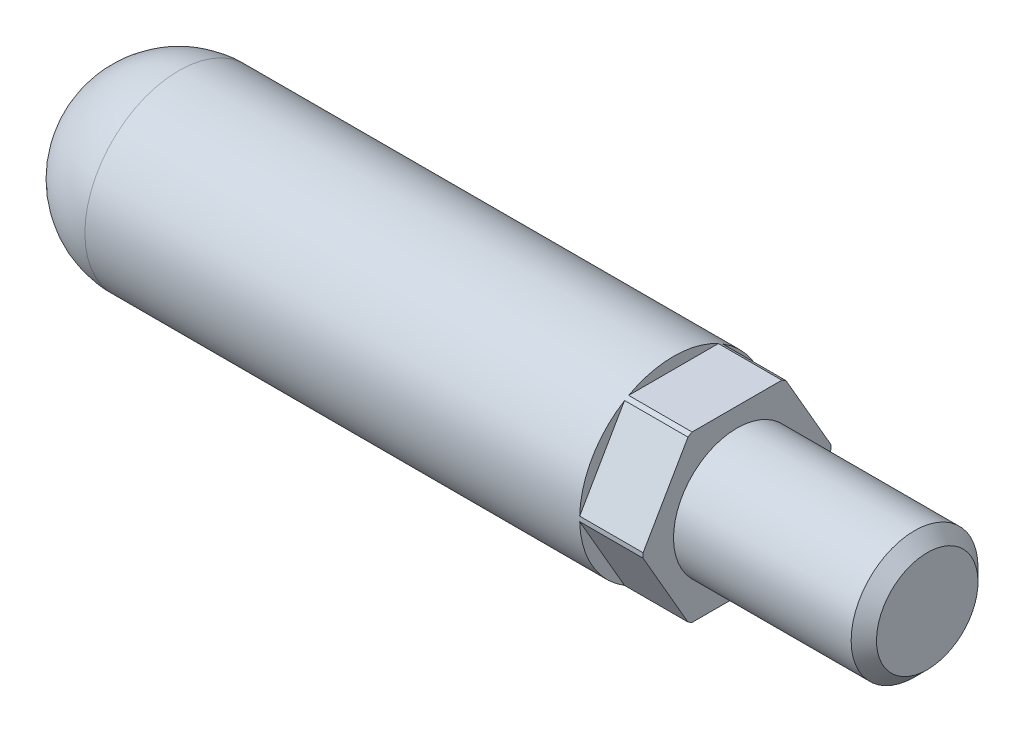
ISO-10303-21;
HEADER;
FILE_DESCRIPTION(('STEP AP214'),'2;1');
FILE_NAME('part.step','',(''),(''),'','','');
FILE_SCHEMA(('AUTOMOTIVE_DESIGN { 1 0 10303 214 1 1 1 1 }'));
ENDSEC;
DATA;
#1=APPLICATION_CONTEXT('core data for automotive mechanical design processes');
#2=APPLICATION_PROTOCOL_DEFINITION('international standard','automotive_design',2000,#1);
#3=PRODUCT_CONTEXT('',#1,'mechanical');
#4=PRODUCT('Part','Part','',(#3));
#5=PRODUCT_RELATED_PRODUCT_CATEGORY('part','',(#4));
#6=PRODUCT_DEFINITION_FORMATION('','',#4);
#7=PRODUCT_DEFINITION_CONTEXT('part definition',#1,'design');
#8=PRODUCT_DEFINITION('design','',#6,#7);
#9=PRODUCT_DEFINITION_SHAPE('','',#8);
#10=(LENGTH_UNIT() NAMED_UNIT(*) SI_UNIT(.MILLI.,.METRE.));
#11=(NAMED_UNIT(*) PLANE_ANGLE_UNIT() SI_UNIT($,.RADIAN.));
#12=(NAMED_UNIT(*) SI_UNIT($,.STERADIAN.) SOLID_ANGLE_UNIT());
#13=UNCERTAINTY_MEASURE_WITH_UNIT(LENGTH_MEASURE(1.E-05),#10,'distance_accuracy_value','');
#14=(GEOMETRIC_REPRESENTATION_CONTEXT(3) GLOBAL_UNCERTAINTY_ASSIGNED_CONTEXT((#13)) GLOBAL_UNIT_ASSIGNED_CONTEXT((#10,
#11,#12)) REPRESENTATION_CONTEXT('',''));
#15=CARTESIAN_POINT('',(0.,0.,0.));
#16=DIRECTION('',(0.,0.,1.));
#17=DIRECTION('',(1.,0.,0.));
#18=AXIS2_PLACEMENT_3D('',#15,#16,#17);
#19=CARTESIAN_POINT('',(0.,2.5,0.));
#20=DIRECTION('',(1.,0.,0.));
#21=DIRECTION('',(0.,0.,-1.));
#22=AXIS2_PLACEMENT_3D('',#19,#20,#21);
#23=PLANE('',#22);
#24=CARTESIAN_POINT('',(5.11590119225969E-10,0.,0.));
#25=DIRECTION('',(-1.,0.,0.));
#26=DIRECTION('',(0.,-1.,0.));
#27=AXIS2_PLACEMENT_3D('',#24,#25,#26);
#28=CIRCLE('',#27,4.00000000047385);
#29=CARTESIAN_POINT('',(5.11590639643012E-10,-4.00000000047385,0.));
#30=VERTEX_POINT('',#29);
#31=EDGE_CURVE('E20',#30,#30,#28,.T.);
#32=ORIENTED_EDGE('',*,*,#31,.F.);
#33=EDGE_LOOP('',(#32));
#34=FACE_BOUND('',#33,.T.);
#35=ADVANCED_FACE('F17',(#34),#23,.T.);
#36=CARTESIAN_POINT('',(-1.0000000004311,0.,0.));
#37=DIRECTION('',(-1.,0.,0.));
#38=DIRECTION('',(0.,-1.,0.));
#39=AXIS2_PLACEMENT_3D('',#36,#37,#38);
#40=CONICAL_SURFACE('',#39,4.99999999959755,0.785398162487953);
#41=ORIENTED_EDGE('',*,*,#31,.T.);
#42=EDGE_LOOP('',(#41));
#43=FACE_BOUND('',#42,.T.);
#44=CARTESIAN_POINT('',(-1.,0.,0.));
#45=DIRECTION('',(1.,0.,0.));
#46=DIRECTION('',(0.,1.,0.));
#47=AXIS2_PLACEMENT_3D('',#44,#45,#46);
#48=CIRCLE('',#47,5.);
#49=CARTESIAN_POINT('',(-1.,5.,0.));
#50=VERTEX_POINT('',#49);
#51=EDGE_CURVE('E200',#50,#50,#48,.F.);
#52=ORIENTED_EDGE('',*,*,#51,.F.);
#53=EDGE_LOOP('',(#52));
#54=FACE_BOUND('',#53,.T.);
#55=ADVANCED_FACE('F215',(#43,#54),#40,.T.);
#56=CARTESIAN_POINT('',(-7.5,0.,0.));
#57=DIRECTION('',(1.,0.,0.));
#58=DIRECTION('',(0.,1.,0.));
#59=AXIS2_PLACEMENT_3D('',#56,#57,#58);
#60=CYLINDRICAL_SURFACE('',#59,5.);
#61=ORIENTED_EDGE('',*,*,#51,.T.);
#62=EDGE_LOOP('',(#61));
#63=FACE_BOUND('',#62,.T.);
#64=CARTESIAN_POINT('',(-15.,0.,0.));
#65=DIRECTION('',(1.,0.,0.));
#66=DIRECTION('',(0.,1.,0.));
#67=AXIS2_PLACEMENT_3D('',#64,#65,#66);
#68=CIRCLE('',#67,5.);
#69=CARTESIAN_POINT('',(-15.,5.,0.));
#70=VERTEX_POINT('',#69);
#71=EDGE_CURVE('E197',#70,#70,#68,.F.);
#72=ORIENTED_EDGE('',*,*,#71,.F.);
#73=EDGE_LOOP('',(#72));
#74=FACE_BOUND('',#73,.T.);
#75=ADVANCED_FACE('F212',(#63,#74),#60,.T.);
#76=CARTESIAN_POINT('',(-15.,6.2,0.));
#77=DIRECTION('',(1.,0.,0.));
#78=DIRECTION('',(0.,0.,-1.));
#79=AXIS2_PLACEMENT_3D('',#76,#77,#78);
#80=PLANE('',#79);
#81=ORIENTED_EDGE('',*,*,#71,.T.);
#82=EDGE_LOOP('',(#81));
#83=FACE_BOUND('',#82,.T.);
#84=DIRECTION('',(0.,-0.866025403784439,0.5));
#85=VECTOR('',#84,1.);
#86=CARTESIAN_POINT('',(-15.,-0.18691332150068,-7.39763904298159));
#87=LINE('',#86,#85);
#88=CARTESIAN_POINT('',(-15.,-6.31308667849932,-3.86069120621611));
#89=VERTEX_POINT('',#88);
#90=CARTESIAN_POINT('',(-15.,-0.186913321500685,-7.39763904298159));
#91=VERTEX_POINT('',#90);
#92=EDGE_CURVE('E186',#89,#91,#87,.F.);
#93=ORIENTED_EDGE('',*,*,#92,.T.);
#94=CARTESIAN_POINT('',(-15.,0.,0.));
#95=DIRECTION('',(1.,0.,0.));
#96=DIRECTION('',(0.,1.,0.));
#97=AXIS2_PLACEMENT_3D('',#94,#95,#96);
#98=CIRCLE('',#97,7.4);
#99=CARTESIAN_POINT('',(-15.,0.186913321500679,-7.39763904298159));
#100=VERTEX_POINT('',#99);
#101=EDGE_CURVE('E282',#91,#100,#98,.T.);
#102=ORIENTED_EDGE('',*,*,#101,.T.);
#103=DIRECTION('',(0.,-0.866025403784439,-0.5));
#104=VECTOR('',#103,1.);
#105=CARTESIAN_POINT('',(-15.,6.31308667849932,-3.86069120621611));
#106=LINE('',#105,#104);
#107=CARTESIAN_POINT('',(-15.,6.31308667849932,-3.86069120621611));
#108=VERTEX_POINT('',#107);
#109=EDGE_CURVE('E195',#100,#108,#106,.F.);
#110=ORIENTED_EDGE('',*,*,#109,.T.);
#111=CARTESIAN_POINT('',(-15.,0.,0.));
#112=DIRECTION('',(1.,0.,0.));
#113=DIRECTION('',(0.,1.,0.));
#114=AXIS2_PLACEMENT_3D('',#111,#112,#113);
#115=CIRCLE('',#114,7.4);
#116=CARTESIAN_POINT('',(-15.,6.5,-3.53694783676547));
#117=VERTEX_POINT('',#116);
#118=EDGE_CURVE('E85',#108,#117,#115,.T.);
#119=ORIENTED_EDGE('',*,*,#118,.T.);
#120=DIRECTION('',(0.,0.,-1.));
#121=VECTOR('',#120,1.);
#122=CARTESIAN_POINT('',(-15.,6.5,3.53694783676548));
#123=LINE('',#122,#121);
#124=CARTESIAN_POINT('',(-15.,6.5,3.53694783676547));
#125=VERTEX_POINT('',#124);
#126=EDGE_CURVE('E127',#117,#125,#123,.F.);
#127=ORIENTED_EDGE('',*,*,#126,.T.);
#128=CARTESIAN_POINT('',(-15.,0.,0.));
#129=DIRECTION('',(1.,0.,0.));
#130=DIRECTION('',(0.,1.,0.));
#131=AXIS2_PLACEMENT_3D('',#128,#129,#130);
#132=CIRCLE('',#131,7.4);
#133=CARTESIAN_POINT('',(-15.,6.31308667849931,3.86069120621611));
#134=VERTEX_POINT('',#133);
#135=EDGE_CURVE('E134',#125,#134,#132,.T.);
#136=ORIENTED_EDGE('',*,*,#135,.T.);
#137=DIRECTION('',(0.,0.866025403784439,-0.5));
#138=VECTOR('',#137,1.);
#139=CARTESIAN_POINT('',(-15.,0.186913321500675,7.39763904298159));
#140=LINE('',#139,#138);
#141=CARTESIAN_POINT('',(-15.,0.186913321500679,7.39763904298159));
#142=VERTEX_POINT('',#141);
#143=EDGE_CURVE('E149',#134,#142,#140,.F.);
#144=ORIENTED_EDGE('',*,*,#143,.T.);
#145=CARTESIAN_POINT('',(-15.,0.,0.));
#146=DIRECTION('',(1.,0.,0.));
#147=DIRECTION('',(0.,1.,0.));
#148=AXIS2_PLACEMENT_3D('',#145,#146,#147);
#149=CIRCLE('',#148,7.4);
#150=CARTESIAN_POINT('',(-15.,-0.186913321500684,7.39763904298159));
#151=VERTEX_POINT('',#150);
#152=EDGE_CURVE('E288',#142,#151,#149,.T.);
#153=ORIENTED_EDGE('',*,*,#152,.T.);
#154=DIRECTION('',(0.,0.866025403784439,0.5));
#155=VECTOR('',#154,1.);
#156=CARTESIAN_POINT('',(-15.,-6.31308667849932,3.86069120621611));
#157=LINE('',#156,#155);
#158=CARTESIAN_POINT('',(-15.,-6.31308667849932,3.86069120621612));
#159=VERTEX_POINT('',#158);
#160=EDGE_CURVE('E161',#151,#159,#157,.F.);
#161=ORIENTED_EDGE('',*,*,#160,.T.);
#162=CARTESIAN_POINT('',(-15.,0.,0.));
#163=DIRECTION('',(1.,0.,0.));
#164=DIRECTION('',(0.,1.,0.));
#165=AXIS2_PLACEMENT_3D('',#162,#163,#164);
#166=CIRCLE('',#165,7.4);
#167=CARTESIAN_POINT('',(-15.,-6.5,3.53694783676548));
#168=VERTEX_POINT('',#167);
#169=EDGE_CURVE('E286',#159,#168,#166,.T.);
#170=ORIENTED_EDGE('',*,*,#169,.T.);
#171=DIRECTION('',(0.,0.,1.));
#172=VECTOR('',#171,1.);
#173=CARTESIAN_POINT('',(-15.,-6.5,-3.53694783676548));
#174=LINE('',#173,#172);
#175=CARTESIAN_POINT('',(-15.,-6.5,-3.53694783676547));
#176=VERTEX_POINT('',#175);
#177=EDGE_CURVE('E174',#168,#176,#174,.F.);
#178=ORIENTED_EDGE('',*,*,#177,.T.);
#179=CARTESIAN_POINT('',(-15.,0.,0.));
#180=DIRECTION('',(1.,0.,0.));
#181=DIRECTION('',(0.,1.,0.));
#182=AXIS2_PLACEMENT_3D('',#179,#180,#181);
#183=CIRCLE('',#182,7.4);
#184=EDGE_CURVE('E284',#176,#89,#183,.T.);
#185=ORIENTED_EDGE('',*,*,#184,.T.);
#186=EDGE_LOOP('',(#93,#102,#110,#119,#127,#136,#144,#153,#161,#170,#178,#185));
#187=FACE_BOUND('',#186,.T.);
#188=ADVANCED_FACE('F208',(#83,#187),#80,.T.);
#189=CARTESIAN_POINT('',(-59.,0.,0.));
#190=DIRECTION('',(0.,-1.,0.));
#191=DIRECTION('',(0.,0.,-1.));
#192=AXIS2_PLACEMENT_3D('',#189,#190,#191);
#193=SPHERICAL_SURFACE('',#192,7.4);
#194=CARTESIAN_POINT('',(-59.,0.,0.));
#195=DIRECTION('',(1.,0.,0.));
#196=DIRECTION('',(0.,1.,0.));
#197=AXIS2_PLACEMENT_3D('',#194,#195,#196);
#198=CIRCLE('',#197,7.4);
#199=CARTESIAN_POINT('',(-59.,-7.4,0.));
#200=VERTEX_POINT('',#199);
#201=CARTESIAN_POINT('',(-59.,7.39999999999999,0.));
#202=VERTEX_POINT('',#201);
#203=EDGE_CURVE('E34',#200,#202,#198,.T.);
#204=ORIENTED_EDGE('',*,*,#203,.F.);
#205=CARTESIAN_POINT('',(-59.,0.,0.));
#206=DIRECTION('',(1.,0.,0.));
#207=DIRECTION('',(0.,1.,0.));
#208=AXIS2_PLACEMENT_3D('',#205,#206,#207);
#209=CIRCLE('',#208,7.4);
#210=EDGE_CURVE('E126',#202,#200,#209,.T.);
#211=ORIENTED_EDGE('',*,*,#210,.F.);
#212=EDGE_LOOP('',(#204,#211));
#213=FACE_BOUND('',#212,.T.);
#214=ADVANCED_FACE('F203',(#213),#193,.T.);
#215=CARTESIAN_POINT('',(-20.,3.3872642821033,-5.86691383526623));
#216=DIRECTION('',(1.,0.,0.));
#217=DIRECTION('',(0.,0.,-1.));
#218=AXIS2_PLACEMENT_3D('',#215,#216,#217);
#219=PLANE('',#218);
#220=DIRECTION('',(0.,-0.866025403784439,-0.5));
#221=VECTOR('',#220,1.);
#222=CARTESIAN_POINT('',(-20.,6.31308667849932,-3.86069120621611));
#223=LINE('',#222,#221);
#224=CARTESIAN_POINT('',(-20.,6.31308667849932,-3.86069120621611));
#225=VERTEX_POINT('',#224);
#226=CARTESIAN_POINT('',(-20.,0.186913321500679,-7.39763904298159));
#227=VERTEX_POINT('',#226);
#228=EDGE_CURVE('E92',#225,#227,#223,.T.);
#229=ORIENTED_EDGE('',*,*,#228,.T.);
#230=CARTESIAN_POINT('',(-20.,0.,0.));
#231=DIRECTION('',(1.,0.,0.));
#232=DIRECTION('',(0.,1.,0.));
#233=AXIS2_PLACEMENT_3D('',#230,#231,#232);
#234=CIRCLE('',#233,7.4);
#235=EDGE_CURVE('E191',#225,#227,#234,.F.);
#236=ORIENTED_EDGE('',*,*,#235,.F.);
#237=EDGE_LOOP('',(#229,#236));
#238=FACE_BOUND('',#237,.T.);
#239=ADVANCED_FACE('F207',(#238),#219,.T.);
#240=CARTESIAN_POINT('',(-15.,6.31308667849932,-3.86069120621611));
#241=DIRECTION('',(0.,-0.5,0.866025403784439));
#242=DIRECTION('',(0.,-0.866025403784439,-0.5));
#243=AXIS2_PLACEMENT_3D('',#240,#241,#242);
#244=PLANE('',#243);
#245=DIRECTION('',(1.,0.,0.));
#246=VECTOR('',#245,1.);
#247=CARTESIAN_POINT('',(-37.,6.31308667849931,-3.86069120621611));
#248=LINE('',#247,#246);
#249=EDGE_CURVE('E189',#108,#225,#248,.F.);
#250=ORIENTED_EDGE('',*,*,#249,.F.);
#251=ORIENTED_EDGE('',*,*,#109,.F.);
#252=DIRECTION('',(1.,0.,0.));
#253=VECTOR('',#252,1.);
#254=CARTESIAN_POINT('',(-37.,0.186913321500678,-7.39763904298159));
#255=LINE('',#254,#253);
#256=EDGE_CURVE('E182',#227,#100,#255,.T.);
#257=ORIENTED_EDGE('',*,*,#256,.F.);
#258=ORIENTED_EDGE('',*,*,#228,.F.);
#259=EDGE_LOOP('',(#250,#251,#257,#258));
#260=FACE_BOUND('',#259,.T.);
#261=ADVANCED_FACE('F266',(#260),#244,.F.);
#262=CARTESIAN_POINT('',(-20.,-3.3872642821033,-5.86691383526624));
#263=DIRECTION('',(1.,0.,0.));
#264=DIRECTION('',(0.,0.,-1.));
#265=AXIS2_PLACEMENT_3D('',#262,#263,#264);
#266=PLANE('',#265);
#267=DIRECTION('',(0.,-0.866025403784439,0.5));
#268=VECTOR('',#267,1.);
#269=CARTESIAN_POINT('',(-20.,-0.18691332150068,-7.39763904298159));
#270=LINE('',#269,#268);
#271=CARTESIAN_POINT('',(-20.,-0.186913321500685,-7.39763904298159));
#272=VERTEX_POINT('',#271);
#273=CARTESIAN_POINT('',(-20.,-6.31308667849932,-3.86069120621611));
#274=VERTEX_POINT('',#273);
#275=EDGE_CURVE('E177',#272,#274,#270,.T.);
#276=ORIENTED_EDGE('',*,*,#275,.T.);
#277=CARTESIAN_POINT('',(-20.,0.,0.));
#278=DIRECTION('',(1.,0.,0.));
#279=DIRECTION('',(0.,1.,0.));
#280=AXIS2_PLACEMENT_3D('',#277,#278,#279);
#281=CIRCLE('',#280,7.4);
#282=EDGE_CURVE('E181',#272,#274,#281,.F.);
#283=ORIENTED_EDGE('',*,*,#282,.F.);
#284=EDGE_LOOP('',(#276,#283));
#285=FACE_BOUND('',#284,.T.);
#286=ADVANCED_FACE('F263',(#285),#266,.T.);
#287=CARTESIAN_POINT('',(-15.,-0.18691332150068,-7.39763904298159));
#288=DIRECTION('',(0.,0.5,0.866025403784439));
#289=DIRECTION('',(0.,-0.866025403784439,0.5));
#290=AXIS2_PLACEMENT_3D('',#287,#288,#289);
#291=PLANE('',#290);
#292=DIRECTION('',(1.,0.,0.));
#293=VECTOR('',#292,1.);
#294=CARTESIAN_POINT('',(-37.,-0.186913321500683,-7.39763904298159));
#295=LINE('',#294,#293);
#296=EDGE_CURVE('E178',#91,#272,#295,.F.);
#297=ORIENTED_EDGE('',*,*,#296,.F.);
#298=ORIENTED_EDGE('',*,*,#92,.F.);
#299=DIRECTION('',(1.,0.,0.));
#300=VECTOR('',#299,1.);
#301=CARTESIAN_POINT('',(-37.,-6.31308667849933,-3.86069120621611));
#302=LINE('',#301,#300);
#303=EDGE_CURVE('E169',#274,#89,#302,.T.);
#304=ORIENTED_EDGE('',*,*,#303,.F.);
#305=ORIENTED_EDGE('',*,*,#275,.F.);
#306=EDGE_LOOP('',(#297,#298,#304,#305));
#307=FACE_BOUND('',#306,.T.);
#308=ADVANCED_FACE('F259',(#307),#291,.F.);
#309=CARTESIAN_POINT('',(-20.,-6.77452856420661,0.));
#310=DIRECTION('',(1.,0.,0.));
#311=DIRECTION('',(0.,0.,-1.));
#312=AXIS2_PLACEMENT_3D('',#309,#310,#311);
#313=PLANE('',#312);
#314=DIRECTION('',(0.,0.,1.));
#315=VECTOR('',#314,1.);
#316=CARTESIAN_POINT('',(-20.,-6.5,-3.53694783676548));
#317=LINE('',#316,#315);
#318=CARTESIAN_POINT('',(-20.,-6.5,-3.53694783676548));
#319=VERTEX_POINT('',#318);
#320=CARTESIAN_POINT('',(-20.,-6.5,3.53694783676548));
#321=VERTEX_POINT('',#320);
#322=EDGE_CURVE('E164',#319,#321,#317,.T.);
#323=ORIENTED_EDGE('',*,*,#322,.T.);
#324=CARTESIAN_POINT('',(-20.,0.,0.));
#325=DIRECTION('',(1.,0.,0.));
#326=DIRECTION('',(0.,1.,0.));
#327=AXIS2_PLACEMENT_3D('',#324,#325,#326);
#328=CIRCLE('',#327,7.4);
#329=EDGE_CURVE('E168',#319,#321,#328,.F.);
#330=ORIENTED_EDGE('',*,*,#329,.F.);
#331=EDGE_LOOP('',(#323,#330));
#332=FACE_BOUND('',#331,.T.);
#333=ADVANCED_FACE('F255',(#332),#313,.T.);
#334=CARTESIAN_POINT('',(-15.,-6.5,-3.53694783676548));
#335=DIRECTION('',(0.,1.,0.));
#336=DIRECTION('',(0.,0.,1.));
#337=AXIS2_PLACEMENT_3D('',#334,#335,#336);
#338=PLANE('',#337);
#339=DIRECTION('',(1.,0.,0.));
#340=VECTOR('',#339,1.);
#341=CARTESIAN_POINT('',(-37.,-6.5,-3.53694783676548));
#342=LINE('',#341,#340);
#343=EDGE_CURVE('E165',#176,#319,#342,.F.);
#344=ORIENTED_EDGE('',*,*,#343,.F.);
#345=ORIENTED_EDGE('',*,*,#177,.F.);
#346=DIRECTION('',(1.,0.,0.));
#347=VECTOR('',#346,1.);
#348=CARTESIAN_POINT('',(-37.,-6.5,3.53694783676548));
#349=LINE('',#348,#347);
#350=EDGE_CURVE('E157',#321,#168,#349,.T.);
#351=ORIENTED_EDGE('',*,*,#350,.F.);
#352=ORIENTED_EDGE('',*,*,#322,.F.);
#353=EDGE_LOOP('',(#344,#345,#351,#352));
#354=FACE_BOUND('',#353,.T.);
#355=ADVANCED_FACE('F251',(#354),#338,.F.);
#356=CARTESIAN_POINT('',(-20.,-3.3872642821033,5.86691383526624));
#357=DIRECTION('',(1.,0.,0.));
#358=DIRECTION('',(0.,0.,-1.));
#359=AXIS2_PLACEMENT_3D('',#356,#357,#358);
#360=PLANE('',#359);
#361=DIRECTION('',(0.,0.866025403784439,0.5));
#362=VECTOR('',#361,1.);
#363=CARTESIAN_POINT('',(-20.,-6.31308667849932,3.86069120621611));
#364=LINE('',#363,#362);
#365=CARTESIAN_POINT('',(-20.,-6.31308667849932,3.86069120621612));
#366=VERTEX_POINT('',#365);
#367=CARTESIAN_POINT('',(-20.,-0.186913321500685,7.39763904298159));
#368=VERTEX_POINT('',#367);
#369=EDGE_CURVE('E152',#366,#368,#364,.T.);
#370=ORIENTED_EDGE('',*,*,#369,.T.);
#371=CARTESIAN_POINT('',(-20.,0.,0.));
#372=DIRECTION('',(1.,0.,0.));
#373=DIRECTION('',(0.,1.,0.));
#374=AXIS2_PLACEMENT_3D('',#371,#372,#373);
#375=CIRCLE('',#374,7.4);
#376=EDGE_CURVE('E156',#366,#368,#375,.F.);
#377=ORIENTED_EDGE('',*,*,#376,.F.);
#378=EDGE_LOOP('',(#370,#377));
#379=FACE_BOUND('',#378,.T.);
#380=ADVANCED_FACE('F247',(#379),#360,.T.);
#381=CARTESIAN_POINT('',(-15.,-6.31308667849932,3.86069120621611));
#382=DIRECTION('',(0.,0.5,-0.866025403784439));
#383=DIRECTION('',(0.,0.866025403784439,0.5));
#384=AXIS2_PLACEMENT_3D('',#381,#382,#383);
#385=PLANE('',#384);
#386=DIRECTION('',(1.,0.,0.));
#387=VECTOR('',#386,1.);
#388=CARTESIAN_POINT('',(-37.,-6.31308667849932,3.86069120621611));
#389=LINE('',#388,#387);
#390=EDGE_CURVE('E153',#159,#366,#389,.F.);
#391=ORIENTED_EDGE('',*,*,#390,.F.);
#392=ORIENTED_EDGE('',*,*,#160,.F.);
#393=DIRECTION('',(1.,0.,0.));
#394=VECTOR('',#393,1.);
#395=CARTESIAN_POINT('',(-37.,-0.186913321500681,7.39763904298159));
#396=LINE('',#395,#394);
#397=EDGE_CURVE('E146',#368,#151,#396,.T.);
#398=ORIENTED_EDGE('',*,*,#397,.F.);
#399=ORIENTED_EDGE('',*,*,#369,.F.);
#400=EDGE_LOOP('',(#391,#392,#398,#399));
#401=FACE_BOUND('',#400,.T.);
#402=ADVANCED_FACE('F243',(#401),#385,.F.);
#403=CARTESIAN_POINT('',(-20.,3.3872642821033,5.86691383526624));
#404=DIRECTION('',(1.,0.,0.));
#405=DIRECTION('',(0.,0.,-1.));
#406=AXIS2_PLACEMENT_3D('',#403,#404,#405);
#407=PLANE('',#406);
#408=CARTESIAN_POINT('',(-20.,0.,0.));
#409=DIRECTION('',(1.,0.,0.));
#410=DIRECTION('',(0.,1.,0.));
#411=AXIS2_PLACEMENT_3D('',#408,#409,#410);
#412=CIRCLE('',#411,7.4);
#413=CARTESIAN_POINT('',(-20.,0.186913321500678,7.39763904298159));
#414=VERTEX_POINT('',#413);
#415=CARTESIAN_POINT('',(-20.,6.31308667849931,3.86069120621611));
#416=VERTEX_POINT('',#415);
#417=EDGE_CURVE('E138',#414,#416,#412,.F.);
#418=ORIENTED_EDGE('',*,*,#417,.F.);
#419=DIRECTION('',(0.,0.866025403784439,-0.5));
#420=VECTOR('',#419,1.);
#421=CARTESIAN_POINT('',(-20.,0.186913321500675,7.39763904298159));
#422=LINE('',#421,#420);
#423=EDGE_CURVE('E143',#414,#416,#422,.T.);
#424=ORIENTED_EDGE('',*,*,#423,.T.);
#425=EDGE_LOOP('',(#418,#424));
#426=FACE_BOUND('',#425,.T.);
#427=ADVANCED_FACE('F239',(#426),#407,.T.);
#428=CARTESIAN_POINT('',(-15.,0.186913321500675,7.39763904298159));
#429=DIRECTION('',(0.,-0.5,-0.866025403784439));
#430=DIRECTION('',(0.,0.866025403784439,-0.5));
#431=AXIS2_PLACEMENT_3D('',#428,#429,#430);
#432=PLANE('',#431);
#433=DIRECTION('',(1.,0.,0.));
#434=VECTOR('',#433,1.);
#435=CARTESIAN_POINT('',(-37.,0.186913321500672,7.39763904298159));
#436=LINE('',#435,#434);
#437=EDGE_CURVE('E144',#142,#414,#436,.F.);
#438=ORIENTED_EDGE('',*,*,#437,.F.);
#439=ORIENTED_EDGE('',*,*,#143,.F.);
#440=DIRECTION('',(1.,0.,0.));
#441=VECTOR('',#440,1.);
#442=CARTESIAN_POINT('',(-37.,6.31308667849931,3.86069120621611));
#443=LINE('',#442,#441);
#444=EDGE_CURVE('E136',#416,#134,#443,.T.);
#445=ORIENTED_EDGE('',*,*,#444,.F.);
#446=ORIENTED_EDGE('',*,*,#423,.F.);
#447=EDGE_LOOP('',(#438,#439,#445,#446));
#448=FACE_BOUND('',#447,.T.);
#449=ADVANCED_FACE('F236',(#448),#432,.F.);
#450=CARTESIAN_POINT('',(-20.,6.7745285642066,0.));
#451=DIRECTION('',(1.,0.,0.));
#452=DIRECTION('',(0.,0.,-1.));
#453=AXIS2_PLACEMENT_3D('',#450,#451,#452);
#454=PLANE('',#453);
#455=DIRECTION('',(0.,0.,-1.));
#456=VECTOR('',#455,1.);
#457=CARTESIAN_POINT('',(-20.,6.5,3.53694783676548));
#458=LINE('',#457,#456);
#459=CARTESIAN_POINT('',(-20.,6.5,3.53694783676547));
#460=VERTEX_POINT('',#459);
#461=CARTESIAN_POINT('',(-20.,6.5,-3.53694783676547));
#462=VERTEX_POINT('',#461);
#463=EDGE_CURVE('E118',#460,#462,#458,.T.);
#464=ORIENTED_EDGE('',*,*,#463,.T.);
#465=CARTESIAN_POINT('',(-20.,0.,0.));
#466=DIRECTION('',(1.,0.,0.));
#467=DIRECTION('',(0.,1.,0.));
#468=AXIS2_PLACEMENT_3D('',#465,#466,#467);
#469=CIRCLE('',#468,7.4);
#470=EDGE_CURVE('E26',#460,#462,#469,.F.);
#471=ORIENTED_EDGE('',*,*,#470,.F.);
#472=EDGE_LOOP('',(#464,#471));
#473=FACE_BOUND('',#472,.T.);
#474=ADVANCED_FACE('F129',(#473),#454,.T.);
#475=CARTESIAN_POINT('',(-15.,6.5,3.53694783676548));
#476=DIRECTION('',(0.,-1.,0.));
#477=DIRECTION('',(0.,0.,-1.));
#478=AXIS2_PLACEMENT_3D('',#475,#476,#477);
#479=PLANE('',#478);
#480=DIRECTION('',(1.,0.,0.));
#481=VECTOR('',#480,1.);
#482=CARTESIAN_POINT('',(-37.,6.5,3.53694783676547));
#483=LINE('',#482,#481);
#484=EDGE_CURVE('E123',#125,#460,#483,.F.);
#485=ORIENTED_EDGE('',*,*,#484,.F.);
#486=ORIENTED_EDGE('',*,*,#126,.F.);
#487=DIRECTION('',(1.,0.,0.));
#488=VECTOR('',#487,1.);
#489=CARTESIAN_POINT('',(-37.,6.49999999999999,-3.53694783676548));
#490=LINE('',#489,#488);
#491=EDGE_CURVE('E11',#462,#117,#490,.T.);
#492=ORIENTED_EDGE('',*,*,#491,.F.);
#493=ORIENTED_EDGE('',*,*,#463,.F.);
#494=EDGE_LOOP('',(#485,#486,#492,#493));
#495=FACE_BOUND('',#494,.T.);
#496=ADVANCED_FACE('F120',(#495),#479,.F.);
#497=CARTESIAN_POINT('',(-37.,0.,0.));
#498=DIRECTION('',(1.,0.,0.));
#499=DIRECTION('',(0.,1.,0.));
#500=AXIS2_PLACEMENT_3D('',#497,#498,#499);
#501=CYLINDRICAL_SURFACE('',#500,7.4);
#502=ORIENTED_EDGE('',*,*,#491,.T.);
#503=ORIENTED_EDGE('',*,*,#118,.F.);
#504=ORIENTED_EDGE('',*,*,#249,.T.);
#505=ORIENTED_EDGE('',*,*,#235,.T.);
#506=ORIENTED_EDGE('',*,*,#256,.T.);
#507=ORIENTED_EDGE('',*,*,#101,.F.);
#508=ORIENTED_EDGE('',*,*,#296,.T.);
#509=ORIENTED_EDGE('',*,*,#282,.T.);
#510=ORIENTED_EDGE('',*,*,#303,.T.);
#511=ORIENTED_EDGE('',*,*,#184,.F.);
#512=ORIENTED_EDGE('',*,*,#343,.T.);
#513=ORIENTED_EDGE('',*,*,#329,.T.);
#514=ORIENTED_EDGE('',*,*,#350,.T.);
#515=ORIENTED_EDGE('',*,*,#169,.F.);
#516=ORIENTED_EDGE('',*,*,#390,.T.);
#517=ORIENTED_EDGE('',*,*,#376,.T.);
#518=ORIENTED_EDGE('',*,*,#397,.T.);
#519=ORIENTED_EDGE('',*,*,#152,.F.);
#520=ORIENTED_EDGE('',*,*,#437,.T.);
#521=ORIENTED_EDGE('',*,*,#417,.T.);
#522=ORIENTED_EDGE('',*,*,#444,.T.);
#523=ORIENTED_EDGE('',*,*,#135,.F.);
#524=ORIENTED_EDGE('',*,*,#484,.T.);
#525=ORIENTED_EDGE('',*,*,#470,.T.);
#526=EDGE_LOOP('',(#502,#503,#504,#505,#506,#507,#508,#509,#510,#511,#512,#513,#514,#515,#516,
#517,#518,#519,#520,#521,#522,#523,#524,#525));
#527=FACE_BOUND('',#526,.T.);
#528=ORIENTED_EDGE('',*,*,#203,.T.);
#529=ORIENTED_EDGE('',*,*,#210,.T.);
#530=EDGE_LOOP('',(#528,#529));
#531=FACE_BOUND('',#530,.T.);
#532=ADVANCED_FACE('F131',(#527,#531),#501,.T.);
#533=CLOSED_SHELL('',(#35,#55,#75,#188,#214,#239,#261,#286,#308,#333,#355,#380,#402,#427,#449,
#474,#496,#532));
#534=MANIFOLD_SOLID_BREP('B1',#533);
#535=ADVANCED_BREP_SHAPE_REPRESENTATION('',(#18,#534),#14);
#536=SHAPE_DEFINITION_REPRESENTATION(#9,#535);
ENDSEC;
END-ISO-10303-21;
